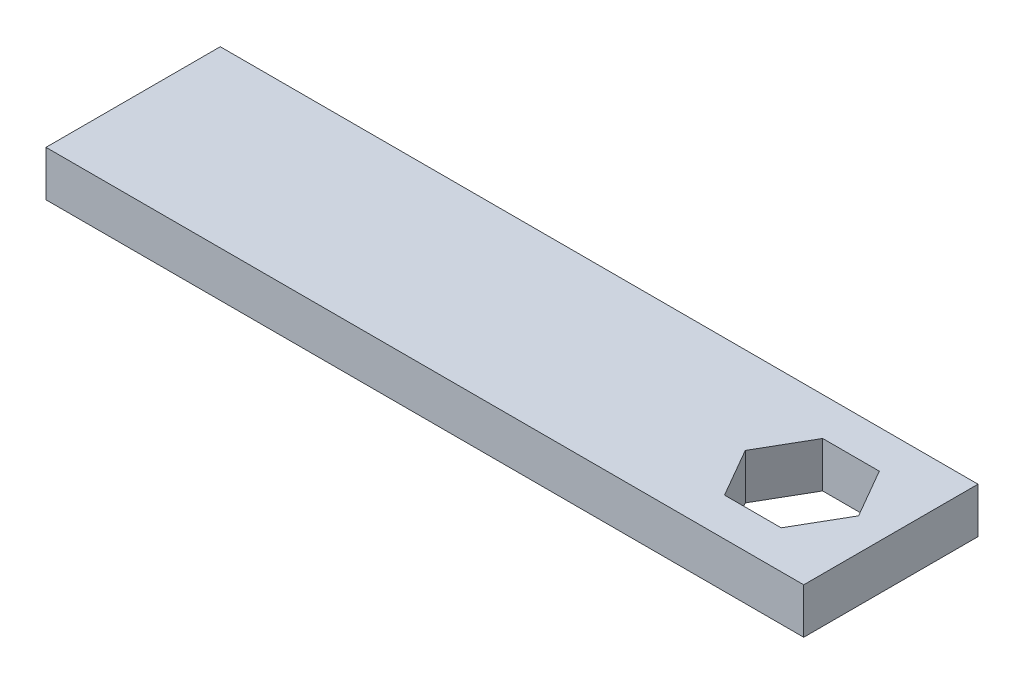
ISO-10303-21;
HEADER;
FILE_DESCRIPTION(('STEP AP214'),'2;1');
FILE_NAME('part.step','',(''),(''),'','','');
FILE_SCHEMA(('AUTOMOTIVE_DESIGN { 1 0 10303 214 1 1 1 1 }'));
ENDSEC;
DATA;
#1=APPLICATION_CONTEXT('core data for automotive mechanical design processes');
#2=APPLICATION_PROTOCOL_DEFINITION('international standard','automotive_design',2000,#1);
#3=PRODUCT_CONTEXT('',#1,'mechanical');
#4=PRODUCT('Part','Part','',(#3));
#5=PRODUCT_RELATED_PRODUCT_CATEGORY('part','',(#4));
#6=PRODUCT_DEFINITION_FORMATION('','',#4);
#7=PRODUCT_DEFINITION_CONTEXT('part definition',#1,'design');
#8=PRODUCT_DEFINITION('design','',#6,#7);
#9=PRODUCT_DEFINITION_SHAPE('','',#8);
#10=(LENGTH_UNIT() NAMED_UNIT(*) SI_UNIT(.MILLI.,.METRE.));
#11=(NAMED_UNIT(*) PLANE_ANGLE_UNIT() SI_UNIT($,.RADIAN.));
#12=(NAMED_UNIT(*) SI_UNIT($,.STERADIAN.) SOLID_ANGLE_UNIT());
#13=UNCERTAINTY_MEASURE_WITH_UNIT(LENGTH_MEASURE(1.E-05),#10,'distance_accuracy_value','');
#14=(GEOMETRIC_REPRESENTATION_CONTEXT(3) GLOBAL_UNCERTAINTY_ASSIGNED_CONTEXT((#13)) GLOBAL_UNIT_ASSIGNED_CONTEXT((#10,
#11,#12)) REPRESENTATION_CONTEXT('',''));
#15=CARTESIAN_POINT('',(0.,0.,0.));
#16=DIRECTION('',(0.,0.,1.));
#17=DIRECTION('',(1.,0.,0.));
#18=AXIS2_PLACEMENT_3D('',#15,#16,#17);
#19=CARTESIAN_POINT('',(84.1579909204938,0.,165.07778963356));
#20=DIRECTION('',(0.,0.,-1.));
#21=DIRECTION('',(-1.,0.,0.));
#22=AXIS2_PLACEMENT_3D('',#19,#20,#21);
#23=PLANE('',#22);
#24=DIRECTION('',(-1.,0.,0.));
#25=VECTOR('',#24,1.);
#26=CARTESIAN_POINT('',(84.1579909204938,6.,165.07778963356));
#27=LINE('',#26,#25);
#28=CARTESIAN_POINT('',(84.1579909204938,6.,165.07778963356));
#29=VERTEX_POINT('',#28);
#30=CARTESIAN_POINT('',(-15.8420090795062,6.,165.07778963356));
#31=VERTEX_POINT('',#30);
#32=EDGE_CURVE('E157',#29,#31,#27,.T.);
#33=ORIENTED_EDGE('',*,*,#32,.F.);
#34=DIRECTION('',(0.,1.,0.));
#35=VECTOR('',#34,1.);
#36=CARTESIAN_POINT('',(84.1579909204938,0.,165.07778963356));
#37=LINE('',#36,#35);
#38=CARTESIAN_POINT('',(84.1579909204938,0.,165.07778963356));
#39=VERTEX_POINT('',#38);
#40=EDGE_CURVE('E11',#39,#29,#37,.T.);
#41=ORIENTED_EDGE('',*,*,#40,.F.);
#42=DIRECTION('',(-1.,0.,0.));
#43=VECTOR('',#42,1.);
#44=CARTESIAN_POINT('',(84.1579909204938,0.,165.07778963356));
#45=LINE('',#44,#43);
#46=CARTESIAN_POINT('',(-15.8420090795062,0.,165.07778963356));
#47=VERTEX_POINT('',#46);
#48=EDGE_CURVE('E165',#39,#47,#45,.T.);
#49=ORIENTED_EDGE('',*,*,#48,.T.);
#50=DIRECTION('',(0.,1.,0.));
#51=VECTOR('',#50,1.);
#52=CARTESIAN_POINT('',(-15.8420090795062,0.,165.07778963356));
#53=LINE('',#52,#51);
#54=EDGE_CURVE('E38',#47,#31,#53,.T.);
#55=ORIENTED_EDGE('',*,*,#54,.T.);
#56=EDGE_LOOP('',(#33,#41,#49,#55));
#57=FACE_BOUND('',#56,.T.);
#58=ADVANCED_FACE('F35',(#57),#23,.T.);
#59=CARTESIAN_POINT('',(84.1579909204938,0.,165.07778963356));
#60=DIRECTION('',(1.,0.,0.));
#61=DIRECTION('',(0.,0.,-1.));
#62=AXIS2_PLACEMENT_3D('',#59,#60,#61);
#63=PLANE('',#62);
#64=DIRECTION('',(0.,0.,-1.));
#65=VECTOR('',#64,1.);
#66=CARTESIAN_POINT('',(84.1579909204938,6.,165.07778963356));
#67=LINE('',#66,#65);
#68=CARTESIAN_POINT('',(84.1579909204938,6.,188.07778963356));
#69=VERTEX_POINT('',#68);
#70=EDGE_CURVE('E169',#69,#29,#67,.T.);
#71=ORIENTED_EDGE('',*,*,#70,.F.);
#72=DIRECTION('',(0.,1.,0.));
#73=VECTOR('',#72,1.);
#74=CARTESIAN_POINT('',(84.1579909204938,0.,188.07778963356));
#75=LINE('',#74,#73);
#76=CARTESIAN_POINT('',(84.1579909204938,0.,188.07778963356));
#77=VERTEX_POINT('',#76);
#78=EDGE_CURVE('E43',#77,#69,#75,.T.);
#79=ORIENTED_EDGE('',*,*,#78,.F.);
#80=DIRECTION('',(0.,0.,-1.));
#81=VECTOR('',#80,1.);
#82=CARTESIAN_POINT('',(84.1579909204938,0.,165.07778963356));
#83=LINE('',#82,#81);
#84=EDGE_CURVE('E175',#77,#39,#83,.T.);
#85=ORIENTED_EDGE('',*,*,#84,.T.);
#86=ORIENTED_EDGE('',*,*,#40,.T.);
#87=EDGE_LOOP('',(#71,#79,#85,#86));
#88=FACE_BOUND('',#87,.T.);
#89=ADVANCED_FACE('F201',(#88),#63,.T.);
#90=CARTESIAN_POINT('',(84.1579909204938,0.,188.07778963356));
#91=DIRECTION('',(0.,0.,1.));
#92=DIRECTION('',(1.,0.,0.));
#93=AXIS2_PLACEMENT_3D('',#90,#91,#92);
#94=PLANE('',#93);
#95=DIRECTION('',(1.,0.,0.));
#96=VECTOR('',#95,1.);
#97=CARTESIAN_POINT('',(84.1579909204938,6.,188.07778963356));
#98=LINE('',#97,#96);
#99=CARTESIAN_POINT('',(-15.8420090795062,6.,188.07778963356));
#100=VERTEX_POINT('',#99);
#101=EDGE_CURVE('E183',#100,#69,#98,.T.);
#102=ORIENTED_EDGE('',*,*,#101,.F.);
#103=DIRECTION('',(0.,1.,0.));
#104=VECTOR('',#103,1.);
#105=CARTESIAN_POINT('',(-15.8420090795062,0.,188.07778963356));
#106=LINE('',#105,#104);
#107=CARTESIAN_POINT('',(-15.8420090795062,0.,188.07778963356));
#108=VERTEX_POINT('',#107);
#109=EDGE_CURVE('E188',#108,#100,#106,.T.);
#110=ORIENTED_EDGE('',*,*,#109,.F.);
#111=DIRECTION('',(1.,0.,0.));
#112=VECTOR('',#111,1.);
#113=CARTESIAN_POINT('',(84.1579909204938,0.,188.07778963356));
#114=LINE('',#113,#112);
#115=EDGE_CURVE('E172',#108,#77,#114,.T.);
#116=ORIENTED_EDGE('',*,*,#115,.T.);
#117=ORIENTED_EDGE('',*,*,#78,.T.);
#118=EDGE_LOOP('',(#102,#110,#116,#117));
#119=FACE_BOUND('',#118,.T.);
#120=ADVANCED_FACE('F205',(#119),#94,.T.);
#121=CARTESIAN_POINT('',(-15.8420090795062,0.,165.07778963356));
#122=DIRECTION('',(-1.,0.,0.));
#123=DIRECTION('',(0.,0.,1.));
#124=AXIS2_PLACEMENT_3D('',#121,#122,#123);
#125=PLANE('',#124);
#126=DIRECTION('',(0.,0.,1.));
#127=VECTOR('',#126,1.);
#128=CARTESIAN_POINT('',(-15.8420090795062,6.,165.07778963356));
#129=LINE('',#128,#127);
#130=EDGE_CURVE('E180',#31,#100,#129,.T.);
#131=ORIENTED_EDGE('',*,*,#130,.F.);
#132=ORIENTED_EDGE('',*,*,#54,.F.);
#133=DIRECTION('',(0.,0.,1.));
#134=VECTOR('',#133,1.);
#135=CARTESIAN_POINT('',(-15.8420090795062,0.,165.07778963356));
#136=LINE('',#135,#134);
#137=EDGE_CURVE('E168',#47,#108,#136,.T.);
#138=ORIENTED_EDGE('',*,*,#137,.T.);
#139=ORIENTED_EDGE('',*,*,#109,.T.);
#140=EDGE_LOOP('',(#131,#132,#138,#139));
#141=FACE_BOUND('',#140,.T.);
#142=ADVANCED_FACE('F196',(#141),#125,.T.);
#143=CARTESIAN_POINT('',(0.,0.,0.));
#144=DIRECTION('',(0.,1.,0.));
#145=DIRECTION('',(0.,0.,1.));
#146=AXIS2_PLACEMENT_3D('',#143,#144,#145);
#147=PLANE('',#146);
#148=DIRECTION('',(-1.,0.,0.));
#149=VECTOR('',#148,1.);
#150=CARTESIAN_POINT('',(76.157990920494,0.,170.10278963356));
#151=LINE('',#150,#149);
#152=CARTESIAN_POINT('',(76.157990920494,0.,170.10278963356));
#153=VERTEX_POINT('',#152);
#154=CARTESIAN_POINT('',(68.6813049344883,0.,170.10278963356));
#155=VERTEX_POINT('',#154);
#156=EDGE_CURVE('E120',#153,#155,#151,.T.);
#157=ORIENTED_EDGE('',*,*,#156,.T.);
#158=DIRECTION('',(-0.500000000000005,0.,0.866025403784436));
#159=VECTOR('',#158,1.);
#160=CARTESIAN_POINT('',(68.6813049344883,0.,170.10278963356));
#161=LINE('',#160,#159);
#162=CARTESIAN_POINT('',(64.9429619414854,0.,176.57778963356));
#163=VERTEX_POINT('',#162);
#164=EDGE_CURVE('E114',#155,#163,#161,.T.);
#165=ORIENTED_EDGE('',*,*,#164,.T.);
#166=DIRECTION('',(0.499999999999994,0.,0.866025403784442));
#167=VECTOR('',#166,1.);
#168=CARTESIAN_POINT('',(64.9429619414854,0.,176.57778963356));
#169=LINE('',#168,#167);
#170=CARTESIAN_POINT('',(68.6813049344882,0.,183.05278963356));
#171=VERTEX_POINT('',#170);
#172=EDGE_CURVE('E123',#163,#171,#169,.T.);
#173=ORIENTED_EDGE('',*,*,#172,.T.);
#174=DIRECTION('',(1.,0.,0.));
#175=VECTOR('',#174,1.);
#176=CARTESIAN_POINT('',(68.6813049344882,0.,183.05278963356));
#177=LINE('',#176,#175);
#178=CARTESIAN_POINT('',(76.1579909204938,0.,183.05278963356));
#179=VERTEX_POINT('',#178);
#180=EDGE_CURVE('E51',#171,#179,#177,.T.);
#181=ORIENTED_EDGE('',*,*,#180,.T.);
#182=DIRECTION('',(0.500000000000005,0.,-0.866025403784436));
#183=VECTOR('',#182,1.);
#184=CARTESIAN_POINT('',(76.1579909204938,0.,183.05278963356));
#185=LINE('',#184,#183);
#186=CARTESIAN_POINT('',(79.8963339134967,0.,176.57778963356));
#187=VERTEX_POINT('',#186);
#188=EDGE_CURVE('E138',#179,#187,#185,.T.);
#189=ORIENTED_EDGE('',*,*,#188,.T.);
#190=DIRECTION('',(-0.499999999999994,0.,-0.866025403784442));
#191=VECTOR('',#190,1.);
#192=CARTESIAN_POINT('',(79.8963339134967,0.,176.57778963356));
#193=LINE('',#192,#191);
#194=EDGE_CURVE('E141',#187,#153,#193,.T.);
#195=ORIENTED_EDGE('',*,*,#194,.T.);
#196=EDGE_LOOP('',(#157,#165,#173,#181,#189,#195));
#197=FACE_BOUND('',#196,.T.);
#198=ORIENTED_EDGE('',*,*,#48,.F.);
#199=ORIENTED_EDGE('',*,*,#84,.F.);
#200=ORIENTED_EDGE('',*,*,#115,.F.);
#201=ORIENTED_EDGE('',*,*,#137,.F.);
#202=EDGE_LOOP('',(#198,#199,#200,#201));
#203=FACE_BOUND('',#202,.T.);
#204=ADVANCED_FACE('F127',(#197,#203),#147,.F.);
#205=CARTESIAN_POINT('',(0.,6.,0.));
#206=DIRECTION('',(0.,1.,0.));
#207=DIRECTION('',(0.,0.,1.));
#208=AXIS2_PLACEMENT_3D('',#205,#206,#207);
#209=PLANE('',#208);
#210=DIRECTION('',(-0.500000000000005,0.,0.866025403784436));
#211=VECTOR('',#210,1.);
#212=CARTESIAN_POINT('',(68.6813049344883,6.,170.10278963356));
#213=LINE('',#212,#211);
#214=CARTESIAN_POINT('',(68.6813049344883,6.,170.10278963356));
#215=VERTEX_POINT('',#214);
#216=CARTESIAN_POINT('',(64.9429619414854,6.,176.57778963356));
#217=VERTEX_POINT('',#216);
#218=EDGE_CURVE('E59',#215,#217,#213,.T.);
#219=ORIENTED_EDGE('',*,*,#218,.F.);
#220=DIRECTION('',(-1.,0.,0.));
#221=VECTOR('',#220,1.);
#222=CARTESIAN_POINT('',(76.157990920494,6.,170.10278963356));
#223=LINE('',#222,#221);
#224=CARTESIAN_POINT('',(76.157990920494,6.,170.10278963356));
#225=VERTEX_POINT('',#224);
#226=EDGE_CURVE('E131',#225,#215,#223,.T.);
#227=ORIENTED_EDGE('',*,*,#226,.F.);
#228=DIRECTION('',(-0.499999999999994,0.,-0.866025403784442));
#229=VECTOR('',#228,1.);
#230=CARTESIAN_POINT('',(79.8963339134967,6.,176.57778963356));
#231=LINE('',#230,#229);
#232=CARTESIAN_POINT('',(79.8963339134967,6.,176.57778963356));
#233=VERTEX_POINT('',#232);
#234=EDGE_CURVE('E134',#233,#225,#231,.T.);
#235=ORIENTED_EDGE('',*,*,#234,.F.);
#236=DIRECTION('',(0.500000000000005,0.,-0.866025403784436));
#237=VECTOR('',#236,1.);
#238=CARTESIAN_POINT('',(76.1579909204938,6.,183.05278963356));
#239=LINE('',#238,#237);
#240=CARTESIAN_POINT('',(76.1579909204938,6.,183.05278963356));
#241=VERTEX_POINT('',#240);
#242=EDGE_CURVE('E150',#241,#233,#239,.T.);
#243=ORIENTED_EDGE('',*,*,#242,.F.);
#244=DIRECTION('',(1.,0.,0.));
#245=VECTOR('',#244,1.);
#246=CARTESIAN_POINT('',(68.6813049344882,6.,183.05278963356));
#247=LINE('',#246,#245);
#248=CARTESIAN_POINT('',(68.6813049344882,6.,183.05278963356));
#249=VERTEX_POINT('',#248);
#250=EDGE_CURVE('E147',#249,#241,#247,.T.);
#251=ORIENTED_EDGE('',*,*,#250,.F.);
#252=DIRECTION('',(0.499999999999994,0.,0.866025403784442));
#253=VECTOR('',#252,1.);
#254=CARTESIAN_POINT('',(64.9429619414854,6.,176.57778963356));
#255=LINE('',#254,#253);
#256=EDGE_CURVE('E145',#217,#249,#255,.T.);
#257=ORIENTED_EDGE('',*,*,#256,.F.);
#258=EDGE_LOOP('',(#219,#227,#235,#243,#251,#257));
#259=FACE_BOUND('',#258,.T.);
#260=ORIENTED_EDGE('',*,*,#32,.T.);
#261=ORIENTED_EDGE('',*,*,#130,.T.);
#262=ORIENTED_EDGE('',*,*,#101,.T.);
#263=ORIENTED_EDGE('',*,*,#70,.T.);
#264=EDGE_LOOP('',(#260,#261,#262,#263));
#265=FACE_BOUND('',#264,.T.);
#266=ADVANCED_FACE('F198',(#259,#265),#209,.T.);
#267=CARTESIAN_POINT('',(68.6813049344883,0.,170.10278963356));
#268=DIRECTION('',(-0.866025403784436,0.,-0.500000000000005));
#269=DIRECTION('',(-0.500000000000005,0.,0.866025403784436));
#270=AXIS2_PLACEMENT_3D('',#267,#268,#269);
#271=PLANE('',#270);
#272=ORIENTED_EDGE('',*,*,#218,.T.);
#273=DIRECTION('',(0.,1.,0.));
#274=VECTOR('',#273,1.);
#275=CARTESIAN_POINT('',(64.9429619414854,0.,176.57778963356));
#276=LINE('',#275,#274);
#277=EDGE_CURVE('E110',#163,#217,#276,.T.);
#278=ORIENTED_EDGE('',*,*,#277,.F.);
#279=ORIENTED_EDGE('',*,*,#164,.F.);
#280=DIRECTION('',(0.,1.,0.));
#281=VECTOR('',#280,1.);
#282=CARTESIAN_POINT('',(68.6813049344883,0.,170.10278963356));
#283=LINE('',#282,#281);
#284=EDGE_CURVE('E155',#155,#215,#283,.T.);
#285=ORIENTED_EDGE('',*,*,#284,.T.);
#286=EDGE_LOOP('',(#272,#278,#279,#285));
#287=FACE_BOUND('',#286,.T.);
#288=ADVANCED_FACE('F112',(#287),#271,.F.);
#289=CARTESIAN_POINT('',(76.157990920494,0.,170.10278963356));
#290=DIRECTION('',(0.,0.,-1.));
#291=DIRECTION('',(-1.,0.,0.));
#292=AXIS2_PLACEMENT_3D('',#289,#290,#291);
#293=PLANE('',#292);
#294=ORIENTED_EDGE('',*,*,#226,.T.);
#295=ORIENTED_EDGE('',*,*,#284,.F.);
#296=ORIENTED_EDGE('',*,*,#156,.F.);
#297=DIRECTION('',(0.,1.,0.));
#298=VECTOR('',#297,1.);
#299=CARTESIAN_POINT('',(76.157990920494,0.,170.10278963356));
#300=LINE('',#299,#298);
#301=EDGE_CURVE('E158',#153,#225,#300,.T.);
#302=ORIENTED_EDGE('',*,*,#301,.T.);
#303=EDGE_LOOP('',(#294,#295,#296,#302));
#304=FACE_BOUND('',#303,.T.);
#305=ADVANCED_FACE('F256',(#304),#293,.F.);
#306=CARTESIAN_POINT('',(79.8963339134967,0.,176.57778963356));
#307=DIRECTION('',(0.866025403784442,0.,-0.499999999999994));
#308=DIRECTION('',(-0.499999999999994,0.,-0.866025403784442));
#309=AXIS2_PLACEMENT_3D('',#306,#307,#308);
#310=PLANE('',#309);
#311=ORIENTED_EDGE('',*,*,#234,.T.);
#312=ORIENTED_EDGE('',*,*,#301,.F.);
#313=ORIENTED_EDGE('',*,*,#194,.F.);
#314=DIRECTION('',(0.,1.,0.));
#315=VECTOR('',#314,1.);
#316=CARTESIAN_POINT('',(79.8963339134967,0.,176.57778963356));
#317=LINE('',#316,#315);
#318=EDGE_CURVE('E160',#187,#233,#317,.T.);
#319=ORIENTED_EDGE('',*,*,#318,.T.);
#320=EDGE_LOOP('',(#311,#312,#313,#319));
#321=FACE_BOUND('',#320,.T.);
#322=ADVANCED_FACE('F265',(#321),#310,.F.);
#323=CARTESIAN_POINT('',(76.1579909204938,0.,183.05278963356));
#324=DIRECTION('',(0.866025403784436,0.,0.500000000000005));
#325=DIRECTION('',(0.500000000000005,0.,-0.866025403784436));
#326=AXIS2_PLACEMENT_3D('',#323,#324,#325);
#327=PLANE('',#326);
#328=ORIENTED_EDGE('',*,*,#242,.T.);
#329=ORIENTED_EDGE('',*,*,#318,.F.);
#330=ORIENTED_EDGE('',*,*,#188,.F.);
#331=DIRECTION('',(0.,1.,0.));
#332=VECTOR('',#331,1.);
#333=CARTESIAN_POINT('',(76.1579909204938,0.,183.05278963356));
#334=LINE('',#333,#332);
#335=EDGE_CURVE('E162',#179,#241,#334,.T.);
#336=ORIENTED_EDGE('',*,*,#335,.T.);
#337=EDGE_LOOP('',(#328,#329,#330,#336));
#338=FACE_BOUND('',#337,.T.);
#339=ADVANCED_FACE('F275',(#338),#327,.F.);
#340=CARTESIAN_POINT('',(68.6813049344882,0.,183.05278963356));
#341=DIRECTION('',(0.,0.,1.));
#342=DIRECTION('',(1.,0.,0.));
#343=AXIS2_PLACEMENT_3D('',#340,#341,#342);
#344=PLANE('',#343);
#345=ORIENTED_EDGE('',*,*,#250,.T.);
#346=ORIENTED_EDGE('',*,*,#335,.F.);
#347=ORIENTED_EDGE('',*,*,#180,.F.);
#348=DIRECTION('',(0.,1.,0.));
#349=VECTOR('',#348,1.);
#350=CARTESIAN_POINT('',(68.6813049344882,0.,183.05278963356));
#351=LINE('',#350,#349);
#352=EDGE_CURVE('E119',#171,#249,#351,.T.);
#353=ORIENTED_EDGE('',*,*,#352,.T.);
#354=EDGE_LOOP('',(#345,#346,#347,#353));
#355=FACE_BOUND('',#354,.T.);
#356=ADVANCED_FACE('F285',(#355),#344,.F.);
#357=CARTESIAN_POINT('',(64.9429619414854,0.,176.57778963356));
#358=DIRECTION('',(-0.866025403784442,0.,0.499999999999994));
#359=DIRECTION('',(0.499999999999994,0.,0.866025403784442));
#360=AXIS2_PLACEMENT_3D('',#357,#358,#359);
#361=PLANE('',#360);
#362=ORIENTED_EDGE('',*,*,#256,.T.);
#363=ORIENTED_EDGE('',*,*,#352,.F.);
#364=ORIENTED_EDGE('',*,*,#172,.F.);
#365=ORIENTED_EDGE('',*,*,#277,.T.);
#366=EDGE_LOOP('',(#362,#363,#364,#365));
#367=FACE_BOUND('',#366,.T.);
#368=ADVANCED_FACE('F124',(#367),#361,.F.);
#369=CLOSED_SHELL('',(#58,#89,#120,#142,#204,#266,#288,#305,#322,#339,#356,#368));
#370=MANIFOLD_SOLID_BREP('B2',#369);
#371=ADVANCED_BREP_SHAPE_REPRESENTATION('',(#18,#370),#14);
#372=SHAPE_DEFINITION_REPRESENTATION(#9,#371);
ENDSEC;
END-ISO-10303-21;
